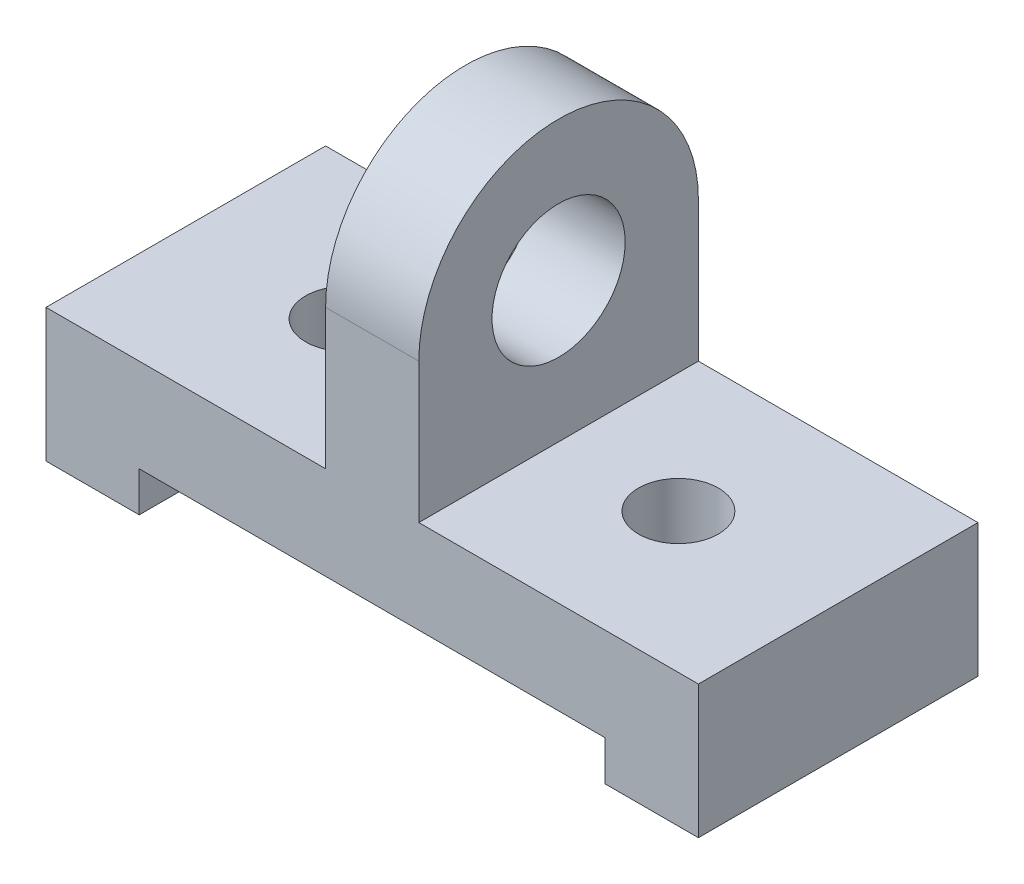
ISO-10303-21;
HEADER;
FILE_DESCRIPTION(('STEP AP214'),'2;1');
FILE_NAME('part.step','',(''),(''),'','','');
FILE_SCHEMA(('AUTOMOTIVE_DESIGN { 1 0 10303 214 1 1 1 1 }'));
ENDSEC;
DATA;
#1=APPLICATION_CONTEXT('core data for automotive mechanical design processes');
#2=APPLICATION_PROTOCOL_DEFINITION('international standard','automotive_design',2000,#1);
#3=PRODUCT_CONTEXT('',#1,'mechanical');
#4=PRODUCT('Part','Part','',(#3));
#5=PRODUCT_RELATED_PRODUCT_CATEGORY('part','',(#4));
#6=PRODUCT_DEFINITION_FORMATION('','',#4);
#7=PRODUCT_DEFINITION_CONTEXT('part definition',#1,'design');
#8=PRODUCT_DEFINITION('design','',#6,#7);
#9=PRODUCT_DEFINITION_SHAPE('','',#8);
#10=(LENGTH_UNIT() NAMED_UNIT(*) SI_UNIT(.MILLI.,.METRE.));
#11=(NAMED_UNIT(*) PLANE_ANGLE_UNIT() SI_UNIT($,.RADIAN.));
#12=(NAMED_UNIT(*) SI_UNIT($,.STERADIAN.) SOLID_ANGLE_UNIT());
#13=UNCERTAINTY_MEASURE_WITH_UNIT(LENGTH_MEASURE(1.E-05),#10,'distance_accuracy_value','');
#14=(GEOMETRIC_REPRESENTATION_CONTEXT(3) GLOBAL_UNCERTAINTY_ASSIGNED_CONTEXT((#13)) GLOBAL_UNIT_ASSIGNED_CONTEXT((#10,
#11,#12)) REPRESENTATION_CONTEXT('',''));
#15=CARTESIAN_POINT('',(0.,0.,0.));
#16=DIRECTION('',(0.,0.,1.));
#17=DIRECTION('',(1.,0.,0.));
#18=AXIS2_PLACEMENT_3D('',#15,#16,#17);
#19=CARTESIAN_POINT('',(7.,41.,0.));
#20=DIRECTION('',(1.,0.,0.));
#21=DIRECTION('',(0.,0.,-1.));
#22=AXIS2_PLACEMENT_3D('',#19,#20,#21);
#23=CYLINDRICAL_SURFACE('',#22,21.);
#24=DIRECTION('',(-1.,0.,0.));
#25=VECTOR('',#24,1.);
#26=CARTESIAN_POINT('',(7.,41.,21.));
#27=LINE('',#26,#25);
#28=CARTESIAN_POINT('',(7.,41.,21.));
#29=VERTEX_POINT('',#28);
#30=CARTESIAN_POINT('',(-7.,41.,21.));
#31=VERTEX_POINT('',#30);
#32=EDGE_CURVE('E177',#29,#31,#27,.T.);
#33=ORIENTED_EDGE('',*,*,#32,.F.);
#34=CARTESIAN_POINT('',(7.,41.,0.));
#35=DIRECTION('',(-1.,0.,0.));
#36=DIRECTION('',(0.,0.,1.));
#37=AXIS2_PLACEMENT_3D('',#34,#35,#36);
#38=CIRCLE('',#37,21.);
#39=CARTESIAN_POINT('',(7.,41.,-21.));
#40=VERTEX_POINT('',#39);
#41=EDGE_CURVE('E43',#40,#29,#38,.F.);
#42=ORIENTED_EDGE('',*,*,#41,.F.);
#43=DIRECTION('',(-1.,0.,0.));
#44=VECTOR('',#43,1.);
#45=CARTESIAN_POINT('',(7.,41.,-21.));
#46=LINE('',#45,#44);
#47=CARTESIAN_POINT('',(-7.,41.,-21.));
#48=VERTEX_POINT('',#47);
#49=EDGE_CURVE('E179',#48,#40,#46,.F.);
#50=ORIENTED_EDGE('',*,*,#49,.F.);
#51=CARTESIAN_POINT('',(-7.,41.,0.));
#52=DIRECTION('',(-1.,0.,0.));
#53=DIRECTION('',(0.,0.,1.));
#54=AXIS2_PLACEMENT_3D('',#51,#52,#53);
#55=CIRCLE('',#54,21.);
#56=EDGE_CURVE('E11',#31,#48,#55,.T.);
#57=ORIENTED_EDGE('',*,*,#56,.F.);
#58=EDGE_LOOP('',(#33,#42,#50,#57));
#59=FACE_BOUND('',#58,.T.);
#60=ADVANCED_FACE('F35',(#59),#23,.T.);
#61=CARTESIAN_POINT('',(0.,20.,0.));
#62=DIRECTION('',(0.,1.,0.));
#63=DIRECTION('',(0.,0.,1.));
#64=AXIS2_PLACEMENT_3D('',#61,#62,#63);
#65=PLANE('',#64);
#66=CARTESIAN_POINT('',(-25.,20.,0.));
#67=DIRECTION('',(0.,1.,0.));
#68=DIRECTION('',(0.,0.,1.));
#69=AXIS2_PLACEMENT_3D('',#66,#67,#68);
#70=CIRCLE('',#69,6.);
#71=CARTESIAN_POINT('',(-25.,20.,6.));
#72=VERTEX_POINT('',#71);
#73=EDGE_CURVE('E193',#72,#72,#70,.T.);
#74=ORIENTED_EDGE('',*,*,#73,.F.);
#75=EDGE_LOOP('',(#74));
#76=FACE_BOUND('',#75,.T.);
#77=DIRECTION('',(1.,0.,0.));
#78=VECTOR('',#77,1.);
#79=CARTESIAN_POINT('',(-49.,20.,21.));
#80=LINE('',#79,#78);
#81=CARTESIAN_POINT('',(-49.,20.,21.));
#82=VERTEX_POINT('',#81);
#83=CARTESIAN_POINT('',(-7.,20.,21.));
#84=VERTEX_POINT('',#83);
#85=EDGE_CURVE('E145',#82,#84,#80,.T.);
#86=ORIENTED_EDGE('',*,*,#85,.T.);
#87=DIRECTION('',(0.,0.,-1.));
#88=VECTOR('',#87,1.);
#89=CARTESIAN_POINT('',(-7.,20.,21.));
#90=LINE('',#89,#88);
#91=CARTESIAN_POINT('',(-7.,20.,-21.));
#92=VERTEX_POINT('',#91);
#93=EDGE_CURVE('E187',#84,#92,#90,.T.);
#94=ORIENTED_EDGE('',*,*,#93,.T.);
#95=DIRECTION('',(-1.,0.,0.));
#96=VECTOR('',#95,1.);
#97=CARTESIAN_POINT('',(-49.,20.,-21.));
#98=LINE('',#97,#96);
#99=CARTESIAN_POINT('',(-49.,20.,-21.));
#100=VERTEX_POINT('',#99);
#101=EDGE_CURVE('E230',#92,#100,#98,.T.);
#102=ORIENTED_EDGE('',*,*,#101,.T.);
#103=DIRECTION('',(0.,0.,1.));
#104=VECTOR('',#103,1.);
#105=CARTESIAN_POINT('',(-49.,20.,-21.));
#106=LINE('',#105,#104);
#107=EDGE_CURVE('E146',#100,#82,#106,.T.);
#108=ORIENTED_EDGE('',*,*,#107,.T.);
#109=EDGE_LOOP('',(#86,#94,#102,#108));
#110=FACE_BOUND('',#109,.T.);
#111=ADVANCED_FACE('F233',(#76,#110),#65,.T.);
#112=CARTESIAN_POINT('',(0.,0.,0.));
#113=DIRECTION('',(0.,1.,0.));
#114=DIRECTION('',(0.,0.,1.));
#115=AXIS2_PLACEMENT_3D('',#112,#113,#114);
#116=PLANE('',#115);
#117=DIRECTION('',(-1.,0.,0.));
#118=VECTOR('',#117,1.);
#119=CARTESIAN_POINT('',(-49.,0.,-21.));
#120=LINE('',#119,#118);
#121=CARTESIAN_POINT('',(-35.,0.,-21.));
#122=VERTEX_POINT('',#121);
#123=CARTESIAN_POINT('',(-49.,0.,-21.));
#124=VERTEX_POINT('',#123);
#125=EDGE_CURVE('E155',#122,#124,#120,.T.);
#126=ORIENTED_EDGE('',*,*,#125,.F.);
#127=DIRECTION('',(0.,0.,1.));
#128=VECTOR('',#127,1.);
#129=CARTESIAN_POINT('',(-35.,0.,-21.));
#130=LINE('',#129,#128);
#131=CARTESIAN_POINT('',(-35.,0.,21.));
#132=VERTEX_POINT('',#131);
#133=EDGE_CURVE('E216',#122,#132,#130,.T.);
#134=ORIENTED_EDGE('',*,*,#133,.T.);
#135=DIRECTION('',(1.,0.,0.));
#136=VECTOR('',#135,1.);
#137=CARTESIAN_POINT('',(-49.,0.,21.));
#138=LINE('',#137,#136);
#139=CARTESIAN_POINT('',(-49.,0.,21.));
#140=VERTEX_POINT('',#139);
#141=EDGE_CURVE('E163',#140,#132,#138,.T.);
#142=ORIENTED_EDGE('',*,*,#141,.F.);
#143=DIRECTION('',(0.,0.,1.));
#144=VECTOR('',#143,1.);
#145=CARTESIAN_POINT('',(-49.,0.,-21.));
#146=LINE('',#145,#144);
#147=EDGE_CURVE('E160',#124,#140,#146,.T.);
#148=ORIENTED_EDGE('',*,*,#147,.F.);
#149=EDGE_LOOP('',(#126,#134,#142,#148));
#150=FACE_BOUND('',#149,.T.);
#151=ADVANCED_FACE('F263',(#150),#116,.F.);
#152=CARTESIAN_POINT('',(49.,20.,-21.));
#153=DIRECTION('',(-1.,0.,0.));
#154=DIRECTION('',(0.,0.,1.));
#155=AXIS2_PLACEMENT_3D('',#152,#153,#154);
#156=PLANE('',#155);
#157=DIRECTION('',(0.,0.,-1.));
#158=VECTOR('',#157,1.);
#159=CARTESIAN_POINT('',(49.,0.,-21.));
#160=LINE('',#159,#158);
#161=CARTESIAN_POINT('',(49.,0.,21.));
#162=VERTEX_POINT('',#161);
#163=CARTESIAN_POINT('',(49.,0.,-21.));
#164=VERTEX_POINT('',#163);
#165=EDGE_CURVE('E152',#162,#164,#160,.T.);
#166=ORIENTED_EDGE('',*,*,#165,.T.);
#167=DIRECTION('',(0.,-1.,0.));
#168=VECTOR('',#167,1.);
#169=CARTESIAN_POINT('',(49.,20.,-21.));
#170=LINE('',#169,#168);
#171=CARTESIAN_POINT('',(49.,20.,-21.));
#172=VERTEX_POINT('',#171);
#173=EDGE_CURVE('E174',#172,#164,#170,.T.);
#174=ORIENTED_EDGE('',*,*,#173,.F.);
#175=DIRECTION('',(0.,0.,-1.));
#176=VECTOR('',#175,1.);
#177=CARTESIAN_POINT('',(49.,20.,-21.));
#178=LINE('',#177,#176);
#179=CARTESIAN_POINT('',(49.,20.,21.));
#180=VERTEX_POINT('',#179);
#181=EDGE_CURVE('E166',#180,#172,#178,.T.);
#182=ORIENTED_EDGE('',*,*,#181,.F.);
#183=DIRECTION('',(0.,-1.,0.));
#184=VECTOR('',#183,1.);
#185=CARTESIAN_POINT('',(49.,20.,21.));
#186=LINE('',#185,#184);
#187=EDGE_CURVE('E143',#180,#162,#186,.T.);
#188=ORIENTED_EDGE('',*,*,#187,.T.);
#189=EDGE_LOOP('',(#166,#174,#182,#188));
#190=FACE_BOUND('',#189,.T.);
#191=ADVANCED_FACE('F269',(#190),#156,.F.);
#192=CARTESIAN_POINT('',(-49.,20.,-21.));
#193=DIRECTION('',(0.,0.,1.));
#194=DIRECTION('',(1.,0.,0.));
#195=AXIS2_PLACEMENT_3D('',#192,#193,#194);
#196=PLANE('',#195);
#197=DIRECTION('',(0.,1.,0.));
#198=VECTOR('',#197,1.);
#199=CARTESIAN_POINT('',(-7.,20.,-21.));
#200=LINE('',#199,#198);
#201=EDGE_CURVE('E184',#92,#48,#200,.T.);
#202=ORIENTED_EDGE('',*,*,#201,.T.);
#203=ORIENTED_EDGE('',*,*,#49,.T.);
#204=DIRECTION('',(0.,1.,0.));
#205=VECTOR('',#204,1.);
#206=CARTESIAN_POINT('',(7.,20.,-21.));
#207=LINE('',#206,#205);
#208=CARTESIAN_POINT('',(7.,20.,-21.));
#209=VERTEX_POINT('',#208);
#210=EDGE_CURVE('E139',#209,#40,#207,.T.);
#211=ORIENTED_EDGE('',*,*,#210,.F.);
#212=EDGE_CURVE('E138',#172,#209,#98,.T.);
#213=ORIENTED_EDGE('',*,*,#212,.F.);
#214=ORIENTED_EDGE('',*,*,#173,.T.);
#215=CARTESIAN_POINT('',(35.,0.,-21.));
#216=VERTEX_POINT('',#215);
#217=EDGE_CURVE('E157',#164,#216,#120,.T.);
#218=ORIENTED_EDGE('',*,*,#217,.T.);
#219=DIRECTION('',(0.,1.,0.));
#220=VECTOR('',#219,1.);
#221=CARTESIAN_POINT('',(35.,0.,-21.));
#222=LINE('',#221,#220);
#223=CARTESIAN_POINT('',(35.,6.,-21.));
#224=VERTEX_POINT('',#223);
#225=EDGE_CURVE('E209',#216,#224,#222,.T.);
#226=ORIENTED_EDGE('',*,*,#225,.T.);
#227=DIRECTION('',(-1.,0.,0.));
#228=VECTOR('',#227,1.);
#229=CARTESIAN_POINT('',(-35.,6.,-21.));
#230=LINE('',#229,#228);
#231=CARTESIAN_POINT('',(-35.,6.,-21.));
#232=VERTEX_POINT('',#231);
#233=EDGE_CURVE('E213',#224,#232,#230,.T.);
#234=ORIENTED_EDGE('',*,*,#233,.T.);
#235=DIRECTION('',(0.,-1.,0.));
#236=VECTOR('',#235,1.);
#237=CARTESIAN_POINT('',(-35.,0.,-21.));
#238=LINE('',#237,#236);
#239=EDGE_CURVE('E206',#232,#122,#238,.T.);
#240=ORIENTED_EDGE('',*,*,#239,.T.);
#241=ORIENTED_EDGE('',*,*,#125,.T.);
#242=DIRECTION('',(0.,-1.,0.));
#243=VECTOR('',#242,1.);
#244=CARTESIAN_POINT('',(-49.,20.,-21.));
#245=LINE('',#244,#243);
#246=EDGE_CURVE('E171',#100,#124,#245,.T.);
#247=ORIENTED_EDGE('',*,*,#246,.F.);
#248=ORIENTED_EDGE('',*,*,#101,.F.);
#249=EDGE_LOOP('',(#202,#203,#211,#213,#214,#218,#226,#234,#240,#241,#247,#248));
#250=FACE_BOUND('',#249,.T.);
#251=ADVANCED_FACE('F182',(#250),#196,.F.);
#252=CARTESIAN_POINT('',(-49.,20.,-21.));
#253=DIRECTION('',(1.,0.,0.));
#254=DIRECTION('',(0.,0.,-1.));
#255=AXIS2_PLACEMENT_3D('',#252,#253,#254);
#256=PLANE('',#255);
#257=ORIENTED_EDGE('',*,*,#147,.T.);
#258=DIRECTION('',(0.,-1.,0.));
#259=VECTOR('',#258,1.);
#260=CARTESIAN_POINT('',(-49.,20.,21.));
#261=LINE('',#260,#259);
#262=EDGE_CURVE('E168',#82,#140,#261,.T.);
#263=ORIENTED_EDGE('',*,*,#262,.F.);
#264=ORIENTED_EDGE('',*,*,#107,.F.);
#265=ORIENTED_EDGE('',*,*,#246,.T.);
#266=EDGE_LOOP('',(#257,#263,#264,#265));
#267=FACE_BOUND('',#266,.T.);
#268=ADVANCED_FACE('F240',(#267),#256,.F.);
#269=CARTESIAN_POINT('',(-49.,20.,21.));
#270=DIRECTION('',(0.,0.,-1.));
#271=DIRECTION('',(-1.,0.,0.));
#272=AXIS2_PLACEMENT_3D('',#269,#270,#271);
#273=PLANE('',#272);
#274=DIRECTION('',(0.,-1.,0.));
#275=VECTOR('',#274,1.);
#276=CARTESIAN_POINT('',(7.,20.,21.));
#277=LINE('',#276,#275);
#278=CARTESIAN_POINT('',(7.,20.,21.));
#279=VERTEX_POINT('',#278);
#280=EDGE_CURVE('E120',#29,#279,#277,.T.);
#281=ORIENTED_EDGE('',*,*,#280,.F.);
#282=ORIENTED_EDGE('',*,*,#32,.T.);
#283=DIRECTION('',(0.,-1.,0.));
#284=VECTOR('',#283,1.);
#285=CARTESIAN_POINT('',(-7.,20.,21.));
#286=LINE('',#285,#284);
#287=EDGE_CURVE('E185',#31,#84,#286,.T.);
#288=ORIENTED_EDGE('',*,*,#287,.T.);
#289=ORIENTED_EDGE('',*,*,#85,.F.);
#290=ORIENTED_EDGE('',*,*,#262,.T.);
#291=ORIENTED_EDGE('',*,*,#141,.T.);
#292=DIRECTION('',(0.,-1.,0.));
#293=VECTOR('',#292,1.);
#294=CARTESIAN_POINT('',(-35.,0.,21.));
#295=LINE('',#294,#293);
#296=CARTESIAN_POINT('',(-35.,6.,21.));
#297=VERTEX_POINT('',#296);
#298=EDGE_CURVE('E201',#297,#132,#295,.T.);
#299=ORIENTED_EDGE('',*,*,#298,.F.);
#300=DIRECTION('',(-1.,0.,0.));
#301=VECTOR('',#300,1.);
#302=CARTESIAN_POINT('',(-35.,6.,21.));
#303=LINE('',#302,#301);
#304=CARTESIAN_POINT('',(35.,6.,21.));
#305=VERTEX_POINT('',#304);
#306=EDGE_CURVE('E210',#305,#297,#303,.T.);
#307=ORIENTED_EDGE('',*,*,#306,.F.);
#308=DIRECTION('',(0.,1.,0.));
#309=VECTOR('',#308,1.);
#310=CARTESIAN_POINT('',(35.,0.,21.));
#311=LINE('',#310,#309);
#312=CARTESIAN_POINT('',(35.,0.,21.));
#313=VERTEX_POINT('',#312);
#314=EDGE_CURVE('E218',#313,#305,#311,.T.);
#315=ORIENTED_EDGE('',*,*,#314,.F.);
#316=EDGE_CURVE('E162',#313,#162,#138,.T.);
#317=ORIENTED_EDGE('',*,*,#316,.T.);
#318=ORIENTED_EDGE('',*,*,#187,.F.);
#319=EDGE_CURVE('E136',#279,#180,#80,.T.);
#320=ORIENTED_EDGE('',*,*,#319,.F.);
#321=EDGE_LOOP('',(#281,#282,#288,#289,#290,#291,#299,#307,#315,#317,#318,#320));
#322=FACE_BOUND('',#321,.T.);
#323=ADVANCED_FACE('F141',(#322),#273,.F.);
#324=DIRECTION('',(0.,0.,-1.));
#325=VECTOR('',#324,1.);
#326=CARTESIAN_POINT('',(7.,20.,21.));
#327=LINE('',#326,#325);
#328=EDGE_CURVE('E124',#279,#209,#327,.T.);
#329=ORIENTED_EDGE('',*,*,#328,.F.);
#330=ORIENTED_EDGE('',*,*,#319,.T.);
#331=ORIENTED_EDGE('',*,*,#181,.T.);
#332=ORIENTED_EDGE('',*,*,#212,.T.);
#333=EDGE_LOOP('',(#329,#330,#331,#332));
#334=FACE_BOUND('',#333,.T.);
#335=CARTESIAN_POINT('',(25.,20.,0.));
#336=DIRECTION('',(0.,1.,0.));
#337=DIRECTION('',(0.,0.,1.));
#338=AXIS2_PLACEMENT_3D('',#335,#336,#337);
#339=CIRCLE('',#338,6.);
#340=CARTESIAN_POINT('',(25.,20.,6.00000000000001));
#341=VERTEX_POINT('',#340);
#342=EDGE_CURVE('E194',#341,#341,#339,.T.);
#343=ORIENTED_EDGE('',*,*,#342,.F.);
#344=EDGE_LOOP('',(#343));
#345=FACE_BOUND('',#344,.T.);
#346=ADVANCED_FACE('F133',(#334,#345),#65,.T.);
#347=ORIENTED_EDGE('',*,*,#316,.F.);
#348=DIRECTION('',(0.,0.,1.));
#349=VECTOR('',#348,1.);
#350=CARTESIAN_POINT('',(35.,0.,-21.));
#351=LINE('',#350,#349);
#352=EDGE_CURVE('E226',#216,#313,#351,.T.);
#353=ORIENTED_EDGE('',*,*,#352,.F.);
#354=ORIENTED_EDGE('',*,*,#217,.F.);
#355=ORIENTED_EDGE('',*,*,#165,.F.);
#356=EDGE_LOOP('',(#347,#353,#354,#355));
#357=FACE_BOUND('',#356,.T.);
#358=ADVANCED_FACE('F272',(#357),#116,.F.);
#359=CARTESIAN_POINT('',(-35.,0.,-21.));
#360=DIRECTION('',(-1.,0.,0.));
#361=DIRECTION('',(0.,0.,1.));
#362=AXIS2_PLACEMENT_3D('',#359,#360,#361);
#363=PLANE('',#362);
#364=ORIENTED_EDGE('',*,*,#298,.T.);
#365=ORIENTED_EDGE('',*,*,#133,.F.);
#366=ORIENTED_EDGE('',*,*,#239,.F.);
#367=DIRECTION('',(0.,0.,1.));
#368=VECTOR('',#367,1.);
#369=CARTESIAN_POINT('',(-35.,6.,-21.));
#370=LINE('',#369,#368);
#371=EDGE_CURVE('E156',#232,#297,#370,.T.);
#372=ORIENTED_EDGE('',*,*,#371,.T.);
#373=EDGE_LOOP('',(#364,#365,#366,#372));
#374=FACE_BOUND('',#373,.T.);
#375=ADVANCED_FACE('F280',(#374),#363,.F.);
#376=CARTESIAN_POINT('',(-35.,6.,-21.));
#377=DIRECTION('',(0.,1.,0.));
#378=DIRECTION('',(0.,0.,1.));
#379=AXIS2_PLACEMENT_3D('',#376,#377,#378);
#380=PLANE('',#379);
#381=CARTESIAN_POINT('',(25.,6.,0.));
#382=DIRECTION('',(0.,1.,0.));
#383=DIRECTION('',(0.,0.,1.));
#384=AXIS2_PLACEMENT_3D('',#381,#382,#383);
#385=CIRCLE('',#384,6.);
#386=CARTESIAN_POINT('',(25.,6.,6.00000000000001));
#387=VERTEX_POINT('',#386);
#388=EDGE_CURVE('E197',#387,#387,#385,.F.);
#389=ORIENTED_EDGE('',*,*,#388,.F.);
#390=EDGE_LOOP('',(#389));
#391=FACE_BOUND('',#390,.T.);
#392=CARTESIAN_POINT('',(-25.,6.,0.));
#393=DIRECTION('',(0.,1.,0.));
#394=DIRECTION('',(0.,0.,1.));
#395=AXIS2_PLACEMENT_3D('',#392,#393,#394);
#396=CIRCLE('',#395,6.);
#397=CARTESIAN_POINT('',(-25.,6.,6.));
#398=VERTEX_POINT('',#397);
#399=EDGE_CURVE('E198',#398,#398,#396,.F.);
#400=ORIENTED_EDGE('',*,*,#399,.F.);
#401=EDGE_LOOP('',(#400));
#402=FACE_BOUND('',#401,.T.);
#403=ORIENTED_EDGE('',*,*,#306,.T.);
#404=ORIENTED_EDGE('',*,*,#371,.F.);
#405=ORIENTED_EDGE('',*,*,#233,.F.);
#406=DIRECTION('',(0.,0.,1.));
#407=VECTOR('',#406,1.);
#408=CARTESIAN_POINT('',(35.,6.,-21.));
#409=LINE('',#408,#407);
#410=EDGE_CURVE('E224',#224,#305,#409,.T.);
#411=ORIENTED_EDGE('',*,*,#410,.T.);
#412=EDGE_LOOP('',(#403,#404,#405,#411));
#413=FACE_BOUND('',#412,.T.);
#414=ADVANCED_FACE('F303',(#391,#402,#413),#380,.F.);
#415=CARTESIAN_POINT('',(35.,0.,-21.));
#416=DIRECTION('',(1.,0.,0.));
#417=DIRECTION('',(0.,0.,-1.));
#418=AXIS2_PLACEMENT_3D('',#415,#416,#417);
#419=PLANE('',#418);
#420=ORIENTED_EDGE('',*,*,#314,.T.);
#421=ORIENTED_EDGE('',*,*,#410,.F.);
#422=ORIENTED_EDGE('',*,*,#225,.F.);
#423=ORIENTED_EDGE('',*,*,#352,.T.);
#424=EDGE_LOOP('',(#420,#421,#422,#423));
#425=FACE_BOUND('',#424,.T.);
#426=ADVANCED_FACE('F299',(#425),#419,.F.);
#427=CARTESIAN_POINT('',(-25.,-10.9705627484771,0.));
#428=DIRECTION('',(0.,1.,0.));
#429=DIRECTION('',(0.,0.,1.));
#430=AXIS2_PLACEMENT_3D('',#427,#428,#429);
#431=CYLINDRICAL_SURFACE('',#430,6.);
#432=ORIENTED_EDGE('',*,*,#399,.T.);
#433=EDGE_LOOP('',(#432));
#434=FACE_BOUND('',#433,.T.);
#435=ORIENTED_EDGE('',*,*,#73,.T.);
#436=EDGE_LOOP('',(#435));
#437=FACE_BOUND('',#436,.T.);
#438=ADVANCED_FACE('F255',(#434,#437),#431,.F.);
#439=CARTESIAN_POINT('',(25.,-10.9705627484771,0.));
#440=DIRECTION('',(0.,1.,0.));
#441=DIRECTION('',(0.,0.,1.));
#442=AXIS2_PLACEMENT_3D('',#439,#440,#441);
#443=CYLINDRICAL_SURFACE('',#442,6.);
#444=ORIENTED_EDGE('',*,*,#388,.T.);
#445=EDGE_LOOP('',(#444));
#446=FACE_BOUND('',#445,.T.);
#447=ORIENTED_EDGE('',*,*,#342,.T.);
#448=EDGE_LOOP('',(#447));
#449=FACE_BOUND('',#448,.T.);
#450=ADVANCED_FACE('F245',(#446,#449),#443,.F.);
#451=CARTESIAN_POINT('',(-7.,0.,0.));
#452=DIRECTION('',(-1.,0.,0.));
#453=DIRECTION('',(0.,0.,1.));
#454=AXIS2_PLACEMENT_3D('',#451,#452,#453);
#455=PLANE('',#454);
#456=CARTESIAN_POINT('',(-7.,41.,0.));
#457=DIRECTION('',(-1.,0.,0.));
#458=DIRECTION('',(0.,0.,1.));
#459=AXIS2_PLACEMENT_3D('',#456,#457,#458);
#460=CIRCLE('',#459,10.);
#461=CARTESIAN_POINT('',(-7.,41.,10.));
#462=VERTEX_POINT('',#461);
#463=EDGE_CURVE('E129',#462,#462,#460,.F.);
#464=ORIENTED_EDGE('',*,*,#463,.T.);
#465=EDGE_LOOP('',(#464));
#466=FACE_BOUND('',#465,.T.);
#467=ORIENTED_EDGE('',*,*,#287,.F.);
#468=ORIENTED_EDGE('',*,*,#56,.T.);
#469=ORIENTED_EDGE('',*,*,#201,.F.);
#470=ORIENTED_EDGE('',*,*,#93,.F.);
#471=EDGE_LOOP('',(#467,#468,#469,#470));
#472=FACE_BOUND('',#471,.T.);
#473=ADVANCED_FACE('F243',(#466,#472),#455,.T.);
#474=CARTESIAN_POINT('',(7.,0.,0.));
#475=DIRECTION('',(-1.,0.,0.));
#476=DIRECTION('',(0.,0.,1.));
#477=AXIS2_PLACEMENT_3D('',#474,#475,#476);
#478=PLANE('',#477);
#479=CARTESIAN_POINT('',(7.,41.,0.));
#480=DIRECTION('',(1.,0.,0.));
#481=DIRECTION('',(0.,0.,-1.));
#482=AXIS2_PLACEMENT_3D('',#479,#480,#481);
#483=CIRCLE('',#482,10.);
#484=CARTESIAN_POINT('',(7.,41.,-10.));
#485=VERTEX_POINT('',#484);
#486=EDGE_CURVE('E381',#485,#485,#483,.T.);
#487=ORIENTED_EDGE('',*,*,#486,.F.);
#488=EDGE_LOOP('',(#487));
#489=FACE_BOUND('',#488,.T.);
#490=ORIENTED_EDGE('',*,*,#210,.T.);
#491=ORIENTED_EDGE('',*,*,#41,.T.);
#492=ORIENTED_EDGE('',*,*,#280,.T.);
#493=ORIENTED_EDGE('',*,*,#328,.T.);
#494=EDGE_LOOP('',(#490,#491,#492,#493));
#495=FACE_BOUND('',#494,.T.);
#496=ADVANCED_FACE('F123',(#489,#495),#478,.F.);
#497=CARTESIAN_POINT('',(-35.2842712474619,41.,0.));
#498=DIRECTION('',(1.,0.,0.));
#499=DIRECTION('',(0.,0.,-1.));
#500=AXIS2_PLACEMENT_3D('',#497,#498,#499);
#501=CYLINDRICAL_SURFACE('',#500,10.);
#502=ORIENTED_EDGE('',*,*,#486,.T.);
#503=EDGE_LOOP('',(#502));
#504=FACE_BOUND('',#503,.T.);
#505=ORIENTED_EDGE('',*,*,#463,.F.);
#506=EDGE_LOOP('',(#505));
#507=FACE_BOUND('',#506,.T.);
#508=ADVANCED_FACE('F252',(#504,#507),#501,.F.);
#509=CLOSED_SHELL('',(#60,#111,#151,#191,#251,#268,#323,#346,#358,#375,#414,#426,#438,#450,#473,
#496,#508));
#510=MANIFOLD_SOLID_BREP('B2',#509);
#511=ADVANCED_BREP_SHAPE_REPRESENTATION('',(#18,#510),#14);
#512=SHAPE_DEFINITION_REPRESENTATION(#9,#511);
ENDSEC;
END-ISO-10303-21;
